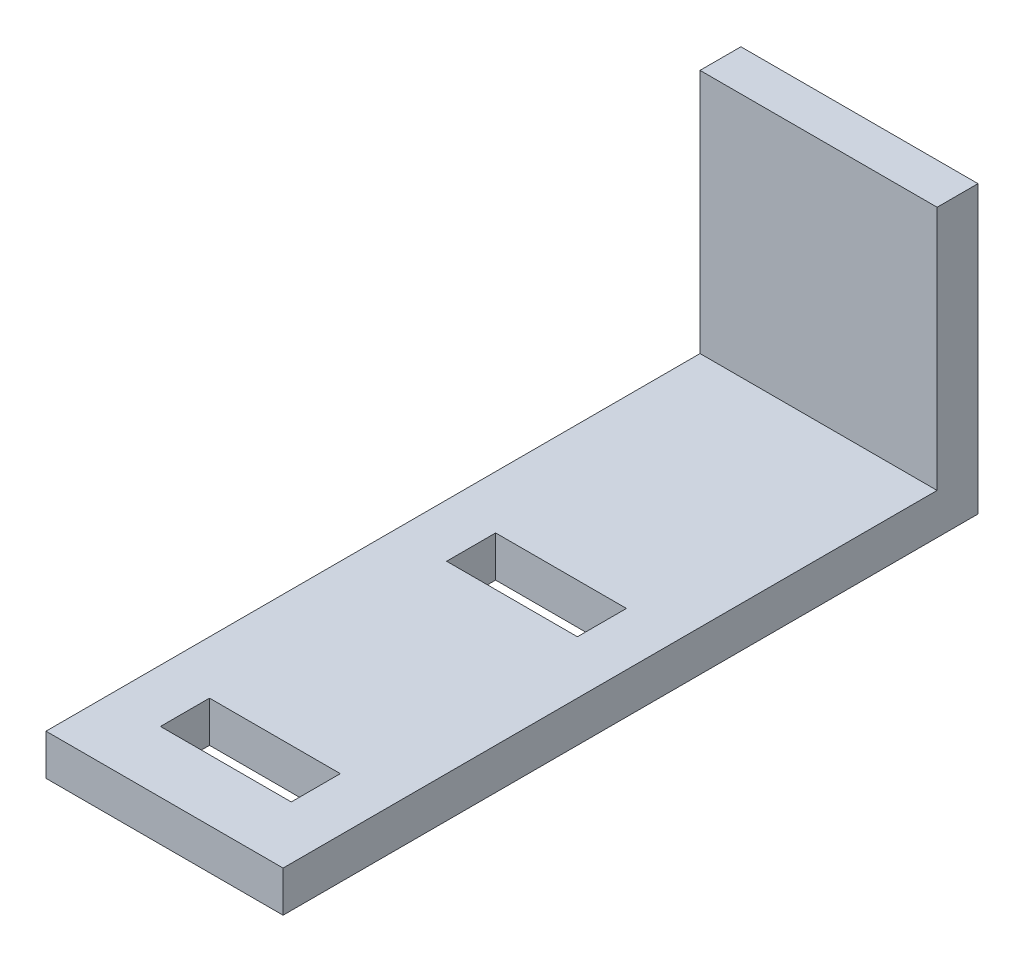
ISO-10303-21;
HEADER;
FILE_DESCRIPTION(('STEP AP214'),'2;1');
FILE_NAME('part.step','',(''),(''),'','','');
FILE_SCHEMA(('AUTOMOTIVE_DESIGN { 1 0 10303 214 1 1 1 1 }'));
ENDSEC;
DATA;
#1=APPLICATION_CONTEXT('core data for automotive mechanical design processes');
#2=APPLICATION_PROTOCOL_DEFINITION('international standard','automotive_design',2000,#1);
#3=PRODUCT_CONTEXT('',#1,'mechanical');
#4=PRODUCT('Part','Part','',(#3));
#5=PRODUCT_RELATED_PRODUCT_CATEGORY('part','',(#4));
#6=PRODUCT_DEFINITION_FORMATION('','',#4);
#7=PRODUCT_DEFINITION_CONTEXT('part definition',#1,'design');
#8=PRODUCT_DEFINITION('design','',#6,#7);
#9=PRODUCT_DEFINITION_SHAPE('','',#8);
#10=(LENGTH_UNIT() NAMED_UNIT(*) SI_UNIT(.MILLI.,.METRE.));
#11=(NAMED_UNIT(*) PLANE_ANGLE_UNIT() SI_UNIT($,.RADIAN.));
#12=(NAMED_UNIT(*) SI_UNIT($,.STERADIAN.) SOLID_ANGLE_UNIT());
#13=UNCERTAINTY_MEASURE_WITH_UNIT(LENGTH_MEASURE(1.E-05),#10,'distance_accuracy_value','');
#14=(GEOMETRIC_REPRESENTATION_CONTEXT(3) GLOBAL_UNCERTAINTY_ASSIGNED_CONTEXT((#13)) GLOBAL_UNIT_ASSIGNED_CONTEXT((#10,
#11,#12)) REPRESENTATION_CONTEXT('',''));
#15=CARTESIAN_POINT('',(0.,0.,0.));
#16=DIRECTION('',(0.,0.,1.));
#17=DIRECTION('',(1.,0.,0.));
#18=AXIS2_PLACEMENT_3D('',#15,#16,#17);
#19=CARTESIAN_POINT('',(-14.5,17.5,5.));
#20=DIRECTION('',(1.,0.,0.));
#21=DIRECTION('',(0.,1.,0.));
#22=AXIS2_PLACEMENT_3D('',#19,#20,#21);
#23=PLANE('',#22);
#24=DIRECTION('',(0.,-1.,0.));
#25=VECTOR('',#24,1.);
#26=CARTESIAN_POINT('',(-14.5,17.5,0.));
#27=LINE('',#26,#25);
#28=CARTESIAN_POINT('',(-14.5,17.5,0.));
#29=VERTEX_POINT('',#28);
#30=CARTESIAN_POINT('',(-14.5,-17.5,0.));
#31=VERTEX_POINT('',#30);
#32=EDGE_CURVE('E231',#29,#31,#27,.T.);
#33=ORIENTED_EDGE('',*,*,#32,.T.);
#34=DIRECTION('',(0.,0.,-1.));
#35=VECTOR('',#34,1.);
#36=CARTESIAN_POINT('',(-14.5,-17.5,5.));
#37=LINE('',#36,#35);
#38=CARTESIAN_POINT('',(-14.5,-17.5,85.));
#39=VERTEX_POINT('',#38);
#40=EDGE_CURVE('E11',#39,#31,#37,.T.);
#41=ORIENTED_EDGE('',*,*,#40,.F.);
#42=DIRECTION('',(0.,-1.,0.));
#43=VECTOR('',#42,1.);
#44=CARTESIAN_POINT('',(-14.5,-17.5,85.));
#45=LINE('',#44,#43);
#46=CARTESIAN_POINT('',(-14.5,-12.5,85.));
#47=VERTEX_POINT('',#46);
#48=EDGE_CURVE('E205',#47,#39,#45,.T.);
#49=ORIENTED_EDGE('',*,*,#48,.F.);
#50=DIRECTION('',(0.,0.,-1.));
#51=VECTOR('',#50,1.);
#52=CARTESIAN_POINT('',(-14.5,-12.5,85.));
#53=LINE('',#52,#51);
#54=CARTESIAN_POINT('',(-14.5,-12.5,5.));
#55=VERTEX_POINT('',#54);
#56=EDGE_CURVE('E215',#47,#55,#53,.T.);
#57=ORIENTED_EDGE('',*,*,#56,.T.);
#58=DIRECTION('',(0.,-1.,0.));
#59=VECTOR('',#58,1.);
#60=CARTESIAN_POINT('',(-14.5,17.5,5.));
#61=LINE('',#60,#59);
#62=CARTESIAN_POINT('',(-14.5,17.5,5.));
#63=VERTEX_POINT('',#62);
#64=EDGE_CURVE('E249',#63,#55,#61,.T.);
#65=ORIENTED_EDGE('',*,*,#64,.F.);
#66=DIRECTION('',(0.,0.,-1.));
#67=VECTOR('',#66,1.);
#68=CARTESIAN_POINT('',(-14.5,17.5,5.));
#69=LINE('',#68,#67);
#70=EDGE_CURVE('E250',#63,#29,#69,.T.);
#71=ORIENTED_EDGE('',*,*,#70,.T.);
#72=EDGE_LOOP('',(#33,#41,#49,#57,#65,#71));
#73=FACE_BOUND('',#72,.T.);
#74=ADVANCED_FACE('F33',(#73),#23,.F.);
#75=CARTESIAN_POINT('',(-14.5,-17.5,5.));
#76=DIRECTION('',(0.,1.,0.));
#77=DIRECTION('',(0.,0.,1.));
#78=AXIS2_PLACEMENT_3D('',#75,#76,#77);
#79=PLANE('',#78);
#80=DIRECTION('',(0.,0.,-1.));
#81=VECTOR('',#80,1.);
#82=CARTESIAN_POINT('',(8.00000000000037,-17.5,5.));
#83=LINE('',#82,#81);
#84=CARTESIAN_POINT('',(8.00000000000037,-17.5,77.5));
#85=VERTEX_POINT('',#84);
#86=CARTESIAN_POINT('',(8.00000000000037,-17.5,71.5));
#87=VERTEX_POINT('',#86);
#88=EDGE_CURVE('E166',#85,#87,#83,.T.);
#89=ORIENTED_EDGE('',*,*,#88,.T.);
#90=DIRECTION('',(-1.,0.,0.));
#91=VECTOR('',#90,1.);
#92=CARTESIAN_POINT('',(-14.5,-17.5,71.5));
#93=LINE('',#92,#91);
#94=CARTESIAN_POINT('',(-7.99999999999963,-17.5,71.5));
#95=VERTEX_POINT('',#94);
#96=EDGE_CURVE('E169',#87,#95,#93,.T.);
#97=ORIENTED_EDGE('',*,*,#96,.T.);
#98=DIRECTION('',(0.,0.,1.));
#99=VECTOR('',#98,1.);
#100=CARTESIAN_POINT('',(-7.99999999999963,-17.5,5.));
#101=LINE('',#100,#99);
#102=CARTESIAN_POINT('',(-7.99999999999963,-17.5,77.5));
#103=VERTEX_POINT('',#102);
#104=EDGE_CURVE('E161',#95,#103,#101,.T.);
#105=ORIENTED_EDGE('',*,*,#104,.T.);
#106=DIRECTION('',(1.,0.,0.));
#107=VECTOR('',#106,1.);
#108=CARTESIAN_POINT('',(-14.4999999999999,-17.5,77.5));
#109=LINE('',#108,#107);
#110=EDGE_CURVE('E141',#103,#85,#109,.T.);
#111=ORIENTED_EDGE('',*,*,#110,.T.);
#112=EDGE_LOOP('',(#89,#97,#105,#111));
#113=FACE_BOUND('',#112,.T.);
#114=DIRECTION('',(-1.,0.,0.));
#115=VECTOR('',#114,1.);
#116=CARTESIAN_POINT('',(-14.5,-17.5,36.5));
#117=LINE('',#116,#115);
#118=CARTESIAN_POINT('',(8.,-17.5,36.5));
#119=VERTEX_POINT('',#118);
#120=CARTESIAN_POINT('',(-8.,-17.5,36.5));
#121=VERTEX_POINT('',#120);
#122=EDGE_CURVE('E198',#119,#121,#117,.T.);
#123=ORIENTED_EDGE('',*,*,#122,.T.);
#124=DIRECTION('',(0.,0.,1.));
#125=VECTOR('',#124,1.);
#126=CARTESIAN_POINT('',(-8.,-17.5,5.));
#127=LINE('',#126,#125);
#128=CARTESIAN_POINT('',(-8.,-17.5,42.5));
#129=VERTEX_POINT('',#128);
#130=EDGE_CURVE('E201',#121,#129,#127,.T.);
#131=ORIENTED_EDGE('',*,*,#130,.T.);
#132=DIRECTION('',(1.,0.,0.));
#133=VECTOR('',#132,1.);
#134=CARTESIAN_POINT('',(-14.5,-17.5,42.5));
#135=LINE('',#134,#133);
#136=CARTESIAN_POINT('',(8.,-17.5,42.5));
#137=VERTEX_POINT('',#136);
#138=EDGE_CURVE('E186',#129,#137,#135,.T.);
#139=ORIENTED_EDGE('',*,*,#138,.T.);
#140=DIRECTION('',(0.,0.,-1.));
#141=VECTOR('',#140,1.);
#142=CARTESIAN_POINT('',(8.,-17.5,5.));
#143=LINE('',#142,#141);
#144=EDGE_CURVE('E195',#137,#119,#143,.T.);
#145=ORIENTED_EDGE('',*,*,#144,.T.);
#146=EDGE_LOOP('',(#123,#131,#139,#145));
#147=FACE_BOUND('',#146,.T.);
#148=DIRECTION('',(1.,0.,0.));
#149=VECTOR('',#148,1.);
#150=CARTESIAN_POINT('',(-14.5,-17.5,0.));
#151=LINE('',#150,#149);
#152=CARTESIAN_POINT('',(14.5,-17.5,0.));
#153=VERTEX_POINT('',#152);
#154=EDGE_CURVE('E236',#31,#153,#151,.T.);
#155=ORIENTED_EDGE('',*,*,#154,.T.);
#156=DIRECTION('',(0.,0.,-1.));
#157=VECTOR('',#156,1.);
#158=CARTESIAN_POINT('',(14.5,-17.5,5.));
#159=LINE('',#158,#157);
#160=CARTESIAN_POINT('',(14.5,-17.5,85.));
#161=VERTEX_POINT('',#160);
#162=EDGE_CURVE('E41',#161,#153,#159,.T.);
#163=ORIENTED_EDGE('',*,*,#162,.F.);
#164=DIRECTION('',(1.,0.,0.));
#165=VECTOR('',#164,1.);
#166=CARTESIAN_POINT('',(-14.5,-17.5,85.));
#167=LINE('',#166,#165);
#168=EDGE_CURVE('E208',#39,#161,#167,.T.);
#169=ORIENTED_EDGE('',*,*,#168,.F.);
#170=ORIENTED_EDGE('',*,*,#40,.T.);
#171=EDGE_LOOP('',(#155,#163,#169,#170));
#172=FACE_BOUND('',#171,.T.);
#173=ADVANCED_FACE('F276',(#113,#147,#172),#79,.F.);
#174=CARTESIAN_POINT('',(14.5,17.5,5.));
#175=DIRECTION('',(-1.,0.,0.));
#176=DIRECTION('',(0.,-1.,0.));
#177=AXIS2_PLACEMENT_3D('',#174,#175,#176);
#178=PLANE('',#177);
#179=DIRECTION('',(0.,1.,0.));
#180=VECTOR('',#179,1.);
#181=CARTESIAN_POINT('',(14.5,17.5,0.));
#182=LINE('',#181,#180);
#183=CARTESIAN_POINT('',(14.5,17.5,0.));
#184=VERTEX_POINT('',#183);
#185=EDGE_CURVE('E241',#153,#184,#182,.T.);
#186=ORIENTED_EDGE('',*,*,#185,.T.);
#187=DIRECTION('',(0.,0.,-1.));
#188=VECTOR('',#187,1.);
#189=CARTESIAN_POINT('',(14.5,17.5,5.));
#190=LINE('',#189,#188);
#191=CARTESIAN_POINT('',(14.5,17.5,5.));
#192=VERTEX_POINT('',#191);
#193=EDGE_CURVE('E252',#192,#184,#190,.T.);
#194=ORIENTED_EDGE('',*,*,#193,.F.);
#195=DIRECTION('',(0.,1.,0.));
#196=VECTOR('',#195,1.);
#197=CARTESIAN_POINT('',(14.5,17.5,5.));
#198=LINE('',#197,#196);
#199=CARTESIAN_POINT('',(14.5,-12.5,5.));
#200=VERTEX_POINT('',#199);
#201=EDGE_CURVE('E224',#200,#192,#198,.T.);
#202=ORIENTED_EDGE('',*,*,#201,.F.);
#203=DIRECTION('',(0.,0.,-1.));
#204=VECTOR('',#203,1.);
#205=CARTESIAN_POINT('',(14.5,-12.5,85.));
#206=LINE('',#205,#204);
#207=CARTESIAN_POINT('',(14.5,-12.5,85.));
#208=VERTEX_POINT('',#207);
#209=EDGE_CURVE('E228',#208,#200,#206,.T.);
#210=ORIENTED_EDGE('',*,*,#209,.F.);
#211=DIRECTION('',(0.,1.,0.));
#212=VECTOR('',#211,1.);
#213=CARTESIAN_POINT('',(14.5,-17.5,85.));
#214=LINE('',#213,#212);
#215=EDGE_CURVE('E211',#161,#208,#214,.T.);
#216=ORIENTED_EDGE('',*,*,#215,.F.);
#217=ORIENTED_EDGE('',*,*,#162,.T.);
#218=EDGE_LOOP('',(#186,#194,#202,#210,#216,#217));
#219=FACE_BOUND('',#218,.T.);
#220=ADVANCED_FACE('F269',(#219),#178,.F.);
#221=CARTESIAN_POINT('',(-14.5,17.5,5.));
#222=DIRECTION('',(0.,-1.,0.));
#223=DIRECTION('',(0.,0.,-1.));
#224=AXIS2_PLACEMENT_3D('',#221,#222,#223);
#225=PLANE('',#224);
#226=DIRECTION('',(-1.,0.,0.));
#227=VECTOR('',#226,1.);
#228=CARTESIAN_POINT('',(-14.5,17.5,0.));
#229=LINE('',#228,#227);
#230=EDGE_CURVE('E247',#184,#29,#229,.T.);
#231=ORIENTED_EDGE('',*,*,#230,.T.);
#232=ORIENTED_EDGE('',*,*,#70,.F.);
#233=DIRECTION('',(-1.,0.,0.));
#234=VECTOR('',#233,1.);
#235=CARTESIAN_POINT('',(-14.5,17.5,5.));
#236=LINE('',#235,#234);
#237=EDGE_CURVE('E244',#192,#63,#236,.T.);
#238=ORIENTED_EDGE('',*,*,#237,.F.);
#239=ORIENTED_EDGE('',*,*,#193,.T.);
#240=EDGE_LOOP('',(#231,#232,#238,#239));
#241=FACE_BOUND('',#240,.T.);
#242=ADVANCED_FACE('F264',(#241),#225,.F.);
#243=CARTESIAN_POINT('',(0.,0.,5.));
#244=DIRECTION('',(0.,0.,1.));
#245=DIRECTION('',(1.,0.,0.));
#246=AXIS2_PLACEMENT_3D('',#243,#244,#245);
#247=PLANE('',#246);
#248=DIRECTION('',(-1.,0.,0.));
#249=VECTOR('',#248,1.);
#250=CARTESIAN_POINT('',(-14.5,-12.5,5.));
#251=LINE('',#250,#249);
#252=EDGE_CURVE('E204',#200,#55,#251,.T.);
#253=ORIENTED_EDGE('',*,*,#252,.F.);
#254=ORIENTED_EDGE('',*,*,#201,.T.);
#255=ORIENTED_EDGE('',*,*,#237,.T.);
#256=ORIENTED_EDGE('',*,*,#64,.T.);
#257=EDGE_LOOP('',(#253,#254,#255,#256));
#258=FACE_BOUND('',#257,.T.);
#259=ADVANCED_FACE('F262',(#258),#247,.T.);
#260=CARTESIAN_POINT('',(0.,0.,0.));
#261=DIRECTION('',(0.,0.,1.));
#262=DIRECTION('',(1.,0.,0.));
#263=AXIS2_PLACEMENT_3D('',#260,#261,#262);
#264=PLANE('',#263);
#265=ORIENTED_EDGE('',*,*,#32,.F.);
#266=ORIENTED_EDGE('',*,*,#230,.F.);
#267=ORIENTED_EDGE('',*,*,#185,.F.);
#268=ORIENTED_EDGE('',*,*,#154,.F.);
#269=EDGE_LOOP('',(#265,#266,#267,#268));
#270=FACE_BOUND('',#269,.T.);
#271=ADVANCED_FACE('F273',(#270),#264,.F.);
#272=CARTESIAN_POINT('',(-14.5,-12.5,85.));
#273=DIRECTION('',(0.,-1.,0.));
#274=DIRECTION('',(0.,0.,-1.));
#275=AXIS2_PLACEMENT_3D('',#272,#273,#274);
#276=PLANE('',#275);
#277=DIRECTION('',(0.,0.,1.));
#278=VECTOR('',#277,1.);
#279=CARTESIAN_POINT('',(-7.99999999999963,-12.5,71.5));
#280=LINE('',#279,#278);
#281=CARTESIAN_POINT('',(-7.99999999999963,-12.5,71.5));
#282=VERTEX_POINT('',#281);
#283=CARTESIAN_POINT('',(-7.99999999999963,-12.5,77.5));
#284=VERTEX_POINT('',#283);
#285=EDGE_CURVE('E147',#282,#284,#280,.T.);
#286=ORIENTED_EDGE('',*,*,#285,.F.);
#287=DIRECTION('',(-1.,0.,0.));
#288=VECTOR('',#287,1.);
#289=CARTESIAN_POINT('',(-7.99999999999963,-12.5,71.5));
#290=LINE('',#289,#288);
#291=CARTESIAN_POINT('',(8.00000000000037,-12.5,71.5));
#292=VERTEX_POINT('',#291);
#293=EDGE_CURVE('E57',#292,#282,#290,.T.);
#294=ORIENTED_EDGE('',*,*,#293,.F.);
#295=DIRECTION('',(0.,0.,-1.));
#296=VECTOR('',#295,1.);
#297=CARTESIAN_POINT('',(8.00000000000037,-12.5,71.5));
#298=LINE('',#297,#296);
#299=CARTESIAN_POINT('',(8.00000000000037,-12.5,77.5));
#300=VERTEX_POINT('',#299);
#301=EDGE_CURVE('E154',#300,#292,#298,.T.);
#302=ORIENTED_EDGE('',*,*,#301,.F.);
#303=DIRECTION('',(1.,0.,0.));
#304=VECTOR('',#303,1.);
#305=CARTESIAN_POINT('',(-7.99999999999963,-12.5,77.5));
#306=LINE('',#305,#304);
#307=EDGE_CURVE('E138',#284,#300,#306,.T.);
#308=ORIENTED_EDGE('',*,*,#307,.F.);
#309=EDGE_LOOP('',(#286,#294,#302,#308));
#310=FACE_BOUND('',#309,.T.);
#311=DIRECTION('',(1.,0.,0.));
#312=VECTOR('',#311,1.);
#313=CARTESIAN_POINT('',(-8.,-12.5,42.5));
#314=LINE('',#313,#312);
#315=CARTESIAN_POINT('',(-8.,-12.5,42.5));
#316=VERTEX_POINT('',#315);
#317=CARTESIAN_POINT('',(8.,-12.5,42.5));
#318=VERTEX_POINT('',#317);
#319=EDGE_CURVE('E174',#316,#318,#314,.T.);
#320=ORIENTED_EDGE('',*,*,#319,.F.);
#321=DIRECTION('',(0.,0.,1.));
#322=VECTOR('',#321,1.);
#323=CARTESIAN_POINT('',(-8.,-12.5,36.5));
#324=LINE('',#323,#322);
#325=CARTESIAN_POINT('',(-8.,-12.5,36.5));
#326=VERTEX_POINT('',#325);
#327=EDGE_CURVE('E172',#326,#316,#324,.T.);
#328=ORIENTED_EDGE('',*,*,#327,.F.);
#329=DIRECTION('',(-1.,0.,0.));
#330=VECTOR('',#329,1.);
#331=CARTESIAN_POINT('',(-8.,-12.5,36.5));
#332=LINE('',#331,#330);
#333=CARTESIAN_POINT('',(8.,-12.5,36.5));
#334=VERTEX_POINT('',#333);
#335=EDGE_CURVE('E180',#334,#326,#332,.T.);
#336=ORIENTED_EDGE('',*,*,#335,.F.);
#337=DIRECTION('',(0.,0.,-1.));
#338=VECTOR('',#337,1.);
#339=CARTESIAN_POINT('',(8.,-12.5,36.5));
#340=LINE('',#339,#338);
#341=EDGE_CURVE('E177',#318,#334,#340,.T.);
#342=ORIENTED_EDGE('',*,*,#341,.F.);
#343=EDGE_LOOP('',(#320,#328,#336,#342));
#344=FACE_BOUND('',#343,.T.);
#345=ORIENTED_EDGE('',*,*,#252,.T.);
#346=ORIENTED_EDGE('',*,*,#56,.F.);
#347=DIRECTION('',(-1.,0.,0.));
#348=VECTOR('',#347,1.);
#349=CARTESIAN_POINT('',(-14.5,-12.5,85.));
#350=LINE('',#349,#348);
#351=EDGE_CURVE('E213',#208,#47,#350,.T.);
#352=ORIENTED_EDGE('',*,*,#351,.F.);
#353=ORIENTED_EDGE('',*,*,#209,.T.);
#354=EDGE_LOOP('',(#345,#346,#352,#353));
#355=FACE_BOUND('',#354,.T.);
#356=ADVANCED_FACE('F151',(#310,#344,#355),#276,.F.);
#357=CARTESIAN_POINT('',(0.,0.,85.));
#358=DIRECTION('',(0.,0.,-1.));
#359=DIRECTION('',(-1.,0.,0.));
#360=AXIS2_PLACEMENT_3D('',#357,#358,#359);
#361=PLANE('',#360);
#362=ORIENTED_EDGE('',*,*,#48,.T.);
#363=ORIENTED_EDGE('',*,*,#168,.T.);
#364=ORIENTED_EDGE('',*,*,#215,.T.);
#365=ORIENTED_EDGE('',*,*,#351,.T.);
#366=EDGE_LOOP('',(#362,#363,#364,#365));
#367=FACE_BOUND('',#366,.T.);
#368=ADVANCED_FACE('F278',(#367),#361,.F.);
#369=CARTESIAN_POINT('',(-8.,-22.5,36.5));
#370=DIRECTION('',(-1.,0.,0.));
#371=DIRECTION('',(0.,0.,1.));
#372=AXIS2_PLACEMENT_3D('',#369,#370,#371);
#373=PLANE('',#372);
#374=DIRECTION('',(0.,1.,0.));
#375=VECTOR('',#374,1.);
#376=CARTESIAN_POINT('',(-8.,-22.5,36.5));
#377=LINE('',#376,#375);
#378=EDGE_CURVE('E184',#121,#326,#377,.T.);
#379=ORIENTED_EDGE('',*,*,#378,.T.);
#380=ORIENTED_EDGE('',*,*,#327,.T.);
#381=DIRECTION('',(0.,1.,0.));
#382=VECTOR('',#381,1.);
#383=CARTESIAN_POINT('',(-8.,-22.5,42.5));
#384=LINE('',#383,#382);
#385=EDGE_CURVE('E183',#129,#316,#384,.T.);
#386=ORIENTED_EDGE('',*,*,#385,.F.);
#387=ORIENTED_EDGE('',*,*,#130,.F.);
#388=EDGE_LOOP('',(#379,#380,#386,#387));
#389=FACE_BOUND('',#388,.T.);
#390=ADVANCED_FACE('F280',(#389),#373,.F.);
#391=CARTESIAN_POINT('',(-8.,-22.5,36.5));
#392=DIRECTION('',(0.,0.,-1.));
#393=DIRECTION('',(-1.,0.,0.));
#394=AXIS2_PLACEMENT_3D('',#391,#392,#393);
#395=PLANE('',#394);
#396=DIRECTION('',(0.,1.,0.));
#397=VECTOR('',#396,1.);
#398=CARTESIAN_POINT('',(8.,-22.5,36.5));
#399=LINE('',#398,#397);
#400=EDGE_CURVE('E187',#119,#334,#399,.T.);
#401=ORIENTED_EDGE('',*,*,#400,.T.);
#402=ORIENTED_EDGE('',*,*,#335,.T.);
#403=ORIENTED_EDGE('',*,*,#378,.F.);
#404=ORIENTED_EDGE('',*,*,#122,.F.);
#405=EDGE_LOOP('',(#401,#402,#403,#404));
#406=FACE_BOUND('',#405,.T.);
#407=ADVANCED_FACE('F286',(#406),#395,.F.);
#408=CARTESIAN_POINT('',(8.,-22.5,36.5));
#409=DIRECTION('',(1.,0.,0.));
#410=DIRECTION('',(0.,0.,-1.));
#411=AXIS2_PLACEMENT_3D('',#408,#409,#410);
#412=PLANE('',#411);
#413=DIRECTION('',(0.,1.,0.));
#414=VECTOR('',#413,1.);
#415=CARTESIAN_POINT('',(8.,-22.5,42.5));
#416=LINE('',#415,#414);
#417=EDGE_CURVE('E189',#137,#318,#416,.T.);
#418=ORIENTED_EDGE('',*,*,#417,.T.);
#419=ORIENTED_EDGE('',*,*,#341,.T.);
#420=ORIENTED_EDGE('',*,*,#400,.F.);
#421=ORIENTED_EDGE('',*,*,#144,.F.);
#422=EDGE_LOOP('',(#418,#419,#420,#421));
#423=FACE_BOUND('',#422,.T.);
#424=ADVANCED_FACE('F338',(#423),#412,.F.);
#425=CARTESIAN_POINT('',(-8.,-22.5,42.5));
#426=DIRECTION('',(0.,0.,1.));
#427=DIRECTION('',(1.,0.,0.));
#428=AXIS2_PLACEMENT_3D('',#425,#426,#427);
#429=PLANE('',#428);
#430=ORIENTED_EDGE('',*,*,#385,.T.);
#431=ORIENTED_EDGE('',*,*,#319,.T.);
#432=ORIENTED_EDGE('',*,*,#417,.F.);
#433=ORIENTED_EDGE('',*,*,#138,.F.);
#434=EDGE_LOOP('',(#430,#431,#432,#433));
#435=FACE_BOUND('',#434,.T.);
#436=ADVANCED_FACE('F348',(#435),#429,.F.);
#437=CARTESIAN_POINT('',(-7.99999999999963,-22.5,71.5));
#438=DIRECTION('',(0.,0.,-1.));
#439=DIRECTION('',(-1.,0.,0.));
#440=AXIS2_PLACEMENT_3D('',#437,#438,#439);
#441=PLANE('',#440);
#442=DIRECTION('',(0.,1.,0.));
#443=VECTOR('',#442,1.);
#444=CARTESIAN_POINT('',(8.00000000000037,-22.5,71.5));
#445=LINE('',#444,#443);
#446=EDGE_CURVE('E159',#87,#292,#445,.T.);
#447=ORIENTED_EDGE('',*,*,#446,.T.);
#448=ORIENTED_EDGE('',*,*,#293,.T.);
#449=DIRECTION('',(0.,1.,0.));
#450=VECTOR('',#449,1.);
#451=CARTESIAN_POINT('',(-7.99999999999963,-22.5,71.5));
#452=LINE('',#451,#450);
#453=EDGE_CURVE('E144',#95,#282,#452,.T.);
#454=ORIENTED_EDGE('',*,*,#453,.F.);
#455=ORIENTED_EDGE('',*,*,#96,.F.);
#456=EDGE_LOOP('',(#447,#448,#454,#455));
#457=FACE_BOUND('',#456,.T.);
#458=ADVANCED_FACE('F358',(#457),#441,.F.);
#459=CARTESIAN_POINT('',(8.00000000000037,-22.5,71.5));
#460=DIRECTION('',(1.,0.,0.));
#461=DIRECTION('',(0.,0.,-1.));
#462=AXIS2_PLACEMENT_3D('',#459,#460,#461);
#463=PLANE('',#462);
#464=DIRECTION('',(0.,1.,0.));
#465=VECTOR('',#464,1.);
#466=CARTESIAN_POINT('',(8.00000000000037,-22.5,77.5));
#467=LINE('',#466,#465);
#468=EDGE_CURVE('E143',#85,#300,#467,.T.);
#469=ORIENTED_EDGE('',*,*,#468,.T.);
#470=ORIENTED_EDGE('',*,*,#301,.T.);
#471=ORIENTED_EDGE('',*,*,#446,.F.);
#472=ORIENTED_EDGE('',*,*,#88,.F.);
#473=EDGE_LOOP('',(#469,#470,#471,#472));
#474=FACE_BOUND('',#473,.T.);
#475=ADVANCED_FACE('F368',(#474),#463,.F.);
#476=CARTESIAN_POINT('',(-7.99999999999963,-22.5,77.5));
#477=DIRECTION('',(0.,0.,1.));
#478=DIRECTION('',(1.,0.,0.));
#479=AXIS2_PLACEMENT_3D('',#476,#477,#478);
#480=PLANE('',#479);
#481=DIRECTION('',(0.,1.,0.));
#482=VECTOR('',#481,1.);
#483=CARTESIAN_POINT('',(-7.99999999999963,-22.5,77.5));
#484=LINE('',#483,#482);
#485=EDGE_CURVE('E49',#103,#284,#484,.T.);
#486=ORIENTED_EDGE('',*,*,#485,.T.);
#487=ORIENTED_EDGE('',*,*,#307,.T.);
#488=ORIENTED_EDGE('',*,*,#468,.F.);
#489=ORIENTED_EDGE('',*,*,#110,.F.);
#490=EDGE_LOOP('',(#486,#487,#488,#489));
#491=FACE_BOUND('',#490,.T.);
#492=ADVANCED_FACE('F135',(#491),#480,.F.);
#493=CARTESIAN_POINT('',(-7.99999999999963,-22.5,71.5));
#494=DIRECTION('',(-1.,0.,0.));
#495=DIRECTION('',(0.,0.,1.));
#496=AXIS2_PLACEMENT_3D('',#493,#494,#495);
#497=PLANE('',#496);
#498=ORIENTED_EDGE('',*,*,#453,.T.);
#499=ORIENTED_EDGE('',*,*,#285,.T.);
#500=ORIENTED_EDGE('',*,*,#485,.F.);
#501=ORIENTED_EDGE('',*,*,#104,.F.);
#502=EDGE_LOOP('',(#498,#499,#500,#501));
#503=FACE_BOUND('',#502,.T.);
#504=ADVANCED_FACE('F148',(#503),#497,.F.);
#505=CLOSED_SHELL('',(#74,#173,#220,#242,#259,#271,#356,#368,#390,#407,#424,#436,#458,#475,#492,#504));
#506=MANIFOLD_SOLID_BREP('B2',#505);
#507=ADVANCED_BREP_SHAPE_REPRESENTATION('',(#18,#506),#14);
#508=SHAPE_DEFINITION_REPRESENTATION(#9,#507);
ENDSEC;
END-ISO-10303-21;
